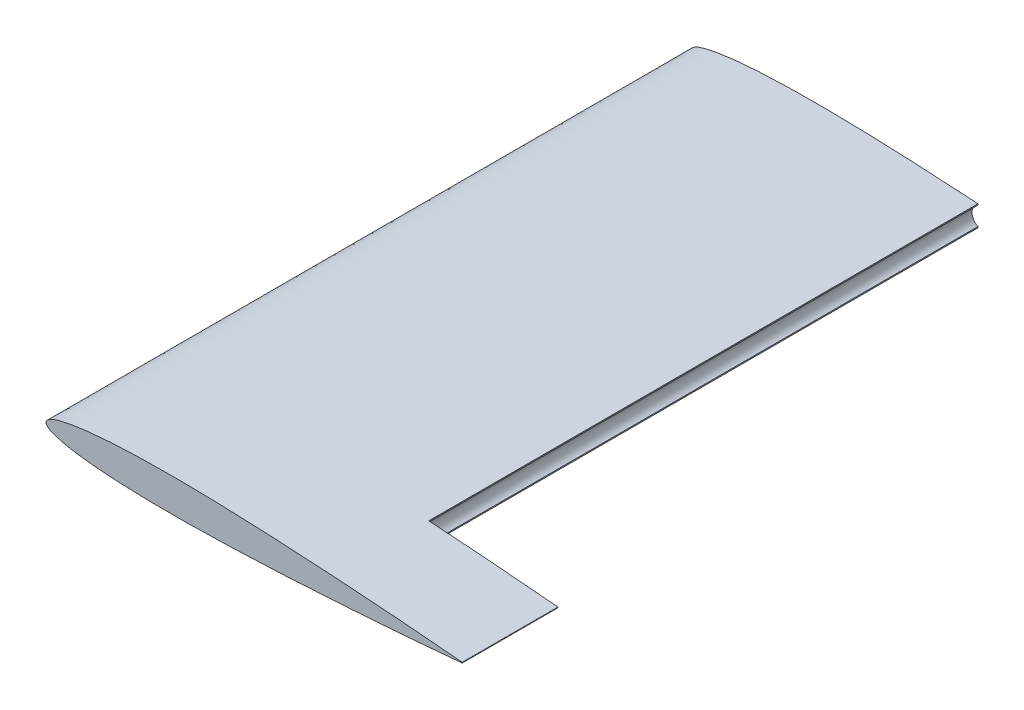
ISO-10303-21;
HEADER;
FILE_DESCRIPTION(('STEP AP214'),'2;1');
FILE_NAME('part.step','',(''),(''),'','','');
FILE_SCHEMA(('AUTOMOTIVE_DESIGN { 1 0 10303 214 1 1 1 1 }'));
ENDSEC;
DATA;
#1=APPLICATION_CONTEXT('core data for automotive mechanical design processes');
#2=APPLICATION_PROTOCOL_DEFINITION('international standard','automotive_design',2000,#1);
#3=PRODUCT_CONTEXT('',#1,'mechanical');
#4=PRODUCT('Part','Part','',(#3));
#5=PRODUCT_RELATED_PRODUCT_CATEGORY('part','',(#4));
#6=PRODUCT_DEFINITION_FORMATION('','',#4);
#7=PRODUCT_DEFINITION_CONTEXT('part definition',#1,'design');
#8=PRODUCT_DEFINITION('design','',#6,#7);
#9=PRODUCT_DEFINITION_SHAPE('','',#8);
#10=(LENGTH_UNIT() NAMED_UNIT(*) SI_UNIT(.MILLI.,.METRE.));
#11=(NAMED_UNIT(*) PLANE_ANGLE_UNIT() SI_UNIT($,.RADIAN.));
#12=(NAMED_UNIT(*) SI_UNIT($,.STERADIAN.) SOLID_ANGLE_UNIT());
#13=UNCERTAINTY_MEASURE_WITH_UNIT(LENGTH_MEASURE(1.E-05),#10,'distance_accuracy_value','');
#14=(GEOMETRIC_REPRESENTATION_CONTEXT(3) GLOBAL_UNCERTAINTY_ASSIGNED_CONTEXT((#13)) GLOBAL_UNIT_ASSIGNED_CONTEXT((#10,
#11,#12)) REPRESENTATION_CONTEXT('',''));
#15=CARTESIAN_POINT('',(0.,0.,0.));
#16=DIRECTION('',(0.,0.,1.));
#17=DIRECTION('',(1.,0.,0.));
#18=AXIS2_PLACEMENT_3D('',#15,#16,#17);
#19=CARTESIAN_POINT('',(34.75,0.,13.));
#20=DIRECTION('',(0.,0.,-1.));
#21=DIRECTION('',(-1.,0.,0.));
#22=AXIS2_PLACEMENT_3D('',#19,#20,#21);
#23=CYLINDRICAL_SURFACE('',#22,1.75);
#24=CARTESIAN_POINT('',(34.75,0.,0.));
#25=DIRECTION('',(0.,0.,-1.));
#26=DIRECTION('',(-1.,0.,0.));
#27=AXIS2_PLACEMENT_3D('',#24,#25,#26);
#28=CIRCLE('',#27,1.75);
#29=CARTESIAN_POINT('',(33.,0.,0.));
#30=VERTEX_POINT('',#29);
#31=EDGE_CURVE('E182',#30,#30,#28,.T.);
#32=CARTESIAN_POINT('',(34.75,0.,6.));
#33=DIRECTION('',(0.,0.,1.));
#34=DIRECTION('',(1.,0.,0.));
#35=AXIS2_PLACEMENT_3D('',#32,#33,#34);
#36=CIRCLE('',#35,1.75);
#37=CARTESIAN_POINT('',(33.,0.,6.));
#38=VERTEX_POINT('',#37);
#39=EDGE_CURVE('E139',#38,#38,#36,.F.);
#40=CARTESIAN_POINT('',(33.,0.,0.));
#41=CARTESIAN_POINT('',(33.,0.,0.0625000000000001));
#42=CARTESIAN_POINT('',(33.,0.,0.125));
#43=CARTESIAN_POINT('',(33.,0.,0.25));
#44=CARTESIAN_POINT('',(33.,0.,0.3125));
#45=CARTESIAN_POINT('',(33.,0.,0.4375));
#46=CARTESIAN_POINT('',(33.,0.,0.5));
#47=CARTESIAN_POINT('',(33.,0.,0.625000000000001));
#48=CARTESIAN_POINT('',(33.,0.,0.687500000000001));
#49=CARTESIAN_POINT('',(33.,0.,0.812500000000001));
#50=CARTESIAN_POINT('',(33.,0.,0.875000000000001));
#51=CARTESIAN_POINT('',(33.,0.,1.));
#52=CARTESIAN_POINT('',(33.,0.,1.0625));
#53=CARTESIAN_POINT('',(33.,0.,1.1875));
#54=CARTESIAN_POINT('',(33.,0.,1.25));
#55=CARTESIAN_POINT('',(33.,0.,1.375));
#56=CARTESIAN_POINT('',(33.,0.,1.4375));
#57=CARTESIAN_POINT('',(33.,0.,1.5625));
#58=CARTESIAN_POINT('',(33.,0.,1.625));
#59=CARTESIAN_POINT('',(33.,0.,1.75));
#60=CARTESIAN_POINT('',(33.,0.,1.8125));
#61=CARTESIAN_POINT('',(33.,0.,1.9375));
#62=CARTESIAN_POINT('',(33.,0.,2.));
#63=CARTESIAN_POINT('',(33.,0.,2.125));
#64=CARTESIAN_POINT('',(33.,0.,2.1875));
#65=CARTESIAN_POINT('',(33.,0.,2.3125));
#66=CARTESIAN_POINT('',(33.,0.,2.375));
#67=CARTESIAN_POINT('',(33.,0.,2.5));
#68=CARTESIAN_POINT('',(33.,0.,2.5625));
#69=CARTESIAN_POINT('',(33.,0.,2.6875));
#70=CARTESIAN_POINT('',(33.,0.,2.75));
#71=CARTESIAN_POINT('',(33.,0.,2.875));
#72=CARTESIAN_POINT('',(33.,0.,2.9375));
#73=CARTESIAN_POINT('',(33.,0.,3.0625));
#74=CARTESIAN_POINT('',(33.,0.,3.125));
#75=CARTESIAN_POINT('',(33.,0.,3.25));
#76=CARTESIAN_POINT('',(33.,0.,3.3125));
#77=CARTESIAN_POINT('',(33.,0.,3.4375));
#78=CARTESIAN_POINT('',(33.,0.,3.5));
#79=CARTESIAN_POINT('',(33.,0.,3.625));
#80=CARTESIAN_POINT('',(33.,0.,3.6875));
#81=CARTESIAN_POINT('',(33.,0.,3.8125));
#82=CARTESIAN_POINT('',(33.,0.,3.875));
#83=CARTESIAN_POINT('',(33.,0.,4.));
#84=CARTESIAN_POINT('',(33.,0.,4.0625));
#85=CARTESIAN_POINT('',(33.,0.,4.1875));
#86=CARTESIAN_POINT('',(33.,0.,4.25));
#87=CARTESIAN_POINT('',(33.,0.,4.375));
#88=CARTESIAN_POINT('',(33.,0.,4.4375));
#89=CARTESIAN_POINT('',(33.,0.,4.5625));
#90=CARTESIAN_POINT('',(33.,0.,4.625));
#91=CARTESIAN_POINT('',(33.,0.,4.75));
#92=CARTESIAN_POINT('',(33.,0.,4.8125));
#93=CARTESIAN_POINT('',(33.,0.,4.9375));
#94=CARTESIAN_POINT('',(33.,0.,5.));
#95=CARTESIAN_POINT('',(33.,0.,5.125));
#96=CARTESIAN_POINT('',(33.,0.,5.1875));
#97=CARTESIAN_POINT('',(33.,0.,5.3125));
#98=CARTESIAN_POINT('',(33.,0.,5.375));
#99=CARTESIAN_POINT('',(33.,0.,5.5));
#100=CARTESIAN_POINT('',(33.,0.,5.5625));
#101=CARTESIAN_POINT('',(33.,0.,5.6875));
#102=CARTESIAN_POINT('',(33.,0.,5.75));
#103=CARTESIAN_POINT('',(33.,0.,5.875));
#104=CARTESIAN_POINT('',(33.,0.,5.9375));
#105=CARTESIAN_POINT('',(33.,0.,6.));
#106=B_SPLINE_CURVE_WITH_KNOTS('',3,(#40,#41,#42,#43,#44,#45,#46,#47,#48,#49,#50,#51,#52,#53,
#54,#55,#56,#57,#58,#59,#60,#61,#62,#63,#64,#65,#66,#67,#68,#69,#70,#71,#72,#73,#74,#75,#76,#77,
#78,#79,#80,#81,#82,#83,#84,#85,#86,#87,#88,#89,#90,#91,#92,#93,#94,#95,#96,#97,#98,#99,#100,
#101,#102,#103,#104,#105),.UNSPECIFIED.,.F.,.F.,(4,2,2,2,2,2,2,2,2,2,2,2,2,2,2,2,2,2,2,2,2,2,2,
2,2,2,2,2,2,2,2,2,4),(0.,0.1875,0.375,0.5625,0.750000000000001,0.937500000000001,1.125,1.3125,
1.5,1.6875,1.875,2.0625,2.25,2.4375,2.625,2.8125,3.,3.1875,3.375,3.5625,3.75,3.9375,4.125,
4.3125,4.5,4.6875,4.875,5.0625,5.25,5.4375,5.625,5.8125,6.),.UNSPECIFIED.);
#107=EDGE_CURVE('BSEAM33',#30,#38,#106,.T.);
#108=ORIENTED_EDGE('',*,*,#31,.T.);
#109=ORIENTED_EDGE('',*,*,#39,.F.);
#110=ORIENTED_EDGE('',*,*,#107,.T.);
#111=ORIENTED_EDGE('',*,*,#107,.F.);
#112=EDGE_LOOP('',(#108,#110,#109,#111));
#113=FACE_BOUND('',#112,.T.);
#114=ADVANCED_FACE('F33',(#113),#23,.F.);
#115=CARTESIAN_POINT('',(71.,0.,0.));
#116=DIRECTION('',(0.,0.,1.));
#117=DIRECTION('',(1.,0.,0.));
#118=AXIS2_PLACEMENT_3D('',#115,#116,#117);
#119=CYLINDRICAL_SURFACE('',#118,1.5);
#120=CARTESIAN_POINT('',(71.,0.,132.));
#121=DIRECTION('',(0.,0.,-1.));
#122=DIRECTION('',(-1.,0.,0.));
#123=AXIS2_PLACEMENT_3D('',#120,#121,#122);
#124=CIRCLE('',#123,1.5);
#125=CARTESIAN_POINT('',(69.5,0.,132.));
#126=VERTEX_POINT('',#125);
#127=EDGE_CURVE('E189',#126,#126,#124,.T.);
#128=ORIENTED_EDGE('',*,*,#127,.T.);
#129=EDGE_LOOP('',(#128));
#130=FACE_BOUND('',#129,.T.);
#131=CARTESIAN_POINT('',(71.,0.,150.));
#132=DIRECTION('',(0.,0.,1.));
#133=DIRECTION('',(1.,0.,0.));
#134=AXIS2_PLACEMENT_3D('',#131,#132,#133);
#135=CIRCLE('',#134,1.5);
#136=CARTESIAN_POINT('',(72.5,0.,150.));
#137=VERTEX_POINT('',#136);
#138=EDGE_CURVE('E261',#137,#137,#135,.F.);
#139=ORIENTED_EDGE('',*,*,#138,.F.);
#140=EDGE_LOOP('',(#139));
#141=FACE_BOUND('',#140,.T.);
#142=ADVANCED_FACE('F295',(#130,#141),#119,.F.);
#143=CARTESIAN_POINT('',(25.,0.,0.));
#144=DIRECTION('',(0.,0.,1.));
#145=DIRECTION('',(1.,0.,0.));
#146=AXIS2_PLACEMENT_3D('',#143,#144,#145);
#147=CYLINDRICAL_SURFACE('',#146,3.);
#148=CARTESIAN_POINT('',(25.,0.,0.));
#149=DIRECTION('',(0.,0.,1.));
#150=DIRECTION('',(1.,0.,0.));
#151=AXIS2_PLACEMENT_3D('',#148,#149,#150);
#152=CIRCLE('',#151,3.);
#153=CARTESIAN_POINT('',(28.,0.,0.));
#154=VERTEX_POINT('',#153);
#155=EDGE_CURVE('E209',#154,#154,#152,.T.);
#156=ORIENTED_EDGE('',*,*,#155,.F.);
#157=EDGE_LOOP('',(#156));
#158=FACE_BOUND('',#157,.T.);
#159=CARTESIAN_POINT('',(25.,0.,150.));
#160=DIRECTION('',(0.,0.,1.));
#161=DIRECTION('',(1.,0.,0.));
#162=AXIS2_PLACEMENT_3D('',#159,#160,#161);
#163=CIRCLE('',#162,3.);
#164=CARTESIAN_POINT('',(28.,0.,150.));
#165=VERTEX_POINT('',#164);
#166=EDGE_CURVE('E248',#165,#165,#163,.F.);
#167=ORIENTED_EDGE('',*,*,#166,.F.);
#168=EDGE_LOOP('',(#167));
#169=FACE_BOUND('',#168,.T.);
#170=ADVANCED_FACE('F303',(#158,#169),#147,.F.);
#171=CARTESIAN_POINT('',(100.,0.084,132.));
#172=CARTESIAN_POINT('',(98.333488814933,0.236746480055364,132.));
#173=CARTESIAN_POINT('',(95.0011947254255,0.542172688557606,132.));
#174=CARTESIAN_POINT('',(88.3355596211879,1.11089898015662,132.));
#175=CARTESIAN_POINT('',(80.0032933562199,1.76361099520967,132.));
#176=CARTESIAN_POINT('',(70.0029989334555,2.45786169254404,132.));
#177=CARTESIAN_POINT('',(60.0031046254057,3.06174772348002,132.));
#178=CARTESIAN_POINT('',(50.0030086005351,3.55213921170033,132.));
#179=CARTESIAN_POINT('',(40.0025985576922,3.90294649372571,132.));
#180=CARTESIAN_POINT('',(31.666961485844,4.02526015065941,132.));
#181=CARTESIAN_POINT('',(24.9991546003269,3.97693379087482,132.));
#182=CARTESIAN_POINT('',(19.9977755867835,3.84497639830756,132.));
#183=CARTESIAN_POINT('',(14.9933631314586,3.59248695861782,132.));
#184=CARTESIAN_POINT('',(10.8271840648808,3.23765157891607,132.));
#185=CARTESIAN_POINT('',(7.48905438800269,2.81402136675529,132.));
#186=CARTESIAN_POINT('',(4.99359465012965,2.40367305928858,132.));
#187=CARTESIAN_POINT('',(2.84962633983361,1.86792549429032,132.));
#188=CARTESIAN_POINT('',(1.16541350274339,1.32098725183071,132.));
#189=CARTESIAN_POINT('',(-0.664613784127027,0.,132.));
#190=CARTESIAN_POINT('',(1.16541350274339,-1.32098725183071,132.));
#191=CARTESIAN_POINT('',(2.84962633983362,-1.86792549429032,132.));
#192=CARTESIAN_POINT('',(4.99359465012963,-2.40367305928857,132.));
#193=CARTESIAN_POINT('',(7.48905438800269,-2.81402136675529,132.));
#194=CARTESIAN_POINT('',(10.8271840648809,-3.23765157891607,132.));
#195=CARTESIAN_POINT('',(14.9933631314586,-3.59248695861782,132.));
#196=CARTESIAN_POINT('',(19.9977755867835,-3.84497639830756,132.));
#197=CARTESIAN_POINT('',(24.9991546003269,-3.97693379087482,132.));
#198=CARTESIAN_POINT('',(31.666961485844,-4.02526015065941,132.));
#199=CARTESIAN_POINT('',(40.0025985576922,-3.90294649372571,132.));
#200=CARTESIAN_POINT('',(50.0030086005351,-3.55213921170033,132.));
#201=CARTESIAN_POINT('',(60.0031046254058,-3.06174772348002,132.));
#202=CARTESIAN_POINT('',(70.0029989334555,-2.45786169254404,132.));
#203=CARTESIAN_POINT('',(80.0032933562199,-1.76361099520967,132.));
#204=CARTESIAN_POINT('',(88.3355596211879,-1.11089898015662,132.));
#205=CARTESIAN_POINT('',(95.0011947254255,-0.542172688557605,132.));
#206=CARTESIAN_POINT('',(98.333488814933,-0.236746480055364,132.));
#207=CARTESIAN_POINT('',(100.,-0.084,132.));
#208=B_SPLINE_CURVE_WITH_KNOTS('',3,(#171,#172,#173,#174,#175,#176,#177,#178,#179,#180,#181,
#182,#183,#184,#185,#186,#187,#188,#189,#190,#191,#192,#193,#194,#195,#196,#197,#198,#199,#200,
#201,#202,#203,#204,#205,#206,#207),.UNSPECIFIED.,.F.,.F.,(4,1,1,1,1,1,1,1,1,1,1,1,1,1,1,1,1,1,
1,1,1,1,1,1,1,1,1,1,1,1,1,1,1,1,4),(0.,0.0248762929189861,0.0497417146704998,0.0994434021110951,
0.149112224036195,0.198750974066913,0.248359097492202,0.297937369716024,0.347491327096237,
0.37226694027957,0.39705092368842,0.421859474838904,0.446731345826762,0.459220451479859,
0.471790601601357,0.484560454432956,0.491195112481227,0.5,0.508804887518773,0.515439545567044,
0.528209398398643,0.540779548520141,0.553268654173238,0.578140525161096,0.60294907631158,
0.62773305972043,0.652508672903763,0.702062630283976,0.751640902507798,0.801249025933086,
0.850887775963805,0.900556597888905,0.9502582853295,0.975123707081014,1.),.UNSPECIFIED.);
#209=DIRECTION('',(0.,0.,-1.));
#210=VECTOR('',#209,1.);
#211=SURFACE_OF_LINEAR_EXTRUSION('',#208,#210);
#212=DIRECTION('',(0.,0.,-1.));
#213=VECTOR('',#212,1.);
#214=CARTESIAN_POINT('',(31.25,-3.998671777626,132.));
#215=LINE('',#214,#213);
#216=CARTESIAN_POINT('',(31.25,-3.998671777626,9.));
#217=VERTEX_POINT('',#216);
#218=CARTESIAN_POINT('',(31.2499999999995,-3.998671777626,6.00000000000001));
#219=VERTEX_POINT('',#218);
#220=EDGE_CURVE('E42',#217,#219,#215,.T.);
#221=ORIENTED_EDGE('',*,*,#220,.F.);
#222=CARTESIAN_POINT('',(100.,0.084,9.00000000000001));
#223=CARTESIAN_POINT('',(98.333488814933,0.236746480055364,9.00000000000001));
#224=CARTESIAN_POINT('',(95.0011947254255,0.542172688557606,9.00000000000001));
#225=CARTESIAN_POINT('',(88.3355596211879,1.11089898015662,9.00000000000001));
#226=CARTESIAN_POINT('',(80.0032933562199,1.76361099520967,9.00000000000001));
#227=CARTESIAN_POINT('',(70.0029989334555,2.45786169254404,9.00000000000001));
#228=CARTESIAN_POINT('',(60.0031046254057,3.06174772348002,9.00000000000001));
#229=CARTESIAN_POINT('',(50.0030086005351,3.55213921170033,9.00000000000001));
#230=CARTESIAN_POINT('',(40.0025985576922,3.90294649372571,9.00000000000001));
#231=CARTESIAN_POINT('',(31.666961485844,4.02526015065941,9.00000000000001));
#232=CARTESIAN_POINT('',(24.9991546003269,3.97693379087482,9.00000000000001));
#233=CARTESIAN_POINT('',(19.9977755867835,3.84497639830756,9.00000000000001));
#234=CARTESIAN_POINT('',(14.9933631314586,3.59248695861782,9.00000000000001));
#235=CARTESIAN_POINT('',(10.8271840648808,3.23765157891607,9.00000000000001));
#236=CARTESIAN_POINT('',(7.48905438800269,2.81402136675529,9.00000000000001));
#237=CARTESIAN_POINT('',(4.99359465012965,2.40367305928858,9.00000000000001));
#238=CARTESIAN_POINT('',(2.84962633983361,1.86792549429032,9.00000000000001));
#239=CARTESIAN_POINT('',(1.16541350274339,1.32098725183071,9.00000000000001));
#240=CARTESIAN_POINT('',(-0.664613784127027,0.,9.00000000000001));
#241=CARTESIAN_POINT('',(1.16541350274339,-1.32098725183071,9.00000000000001));
#242=CARTESIAN_POINT('',(2.84962633983362,-1.86792549429032,9.00000000000001));
#243=CARTESIAN_POINT('',(4.99359465012963,-2.40367305928857,9.00000000000001));
#244=CARTESIAN_POINT('',(7.48905438800269,-2.81402136675529,9.00000000000001));
#245=CARTESIAN_POINT('',(10.8271840648809,-3.23765157891607,9.00000000000001));
#246=CARTESIAN_POINT('',(14.9933631314586,-3.59248695861782,9.00000000000001));
#247=CARTESIAN_POINT('',(19.9977755867835,-3.84497639830756,9.00000000000001));
#248=CARTESIAN_POINT('',(24.9991546003269,-3.97693379087482,9.00000000000001));
#249=CARTESIAN_POINT('',(31.666961485844,-4.02526015065941,9.00000000000001));
#250=CARTESIAN_POINT('',(40.0025985576922,-3.90294649372571,9.00000000000001));
#251=CARTESIAN_POINT('',(50.0030086005351,-3.55213921170033,9.00000000000001));
#252=CARTESIAN_POINT('',(60.0031046254058,-3.06174772348002,9.00000000000001));
#253=CARTESIAN_POINT('',(70.0029989334555,-2.45786169254404,9.00000000000001));
#254=CARTESIAN_POINT('',(80.0032933562199,-1.76361099520967,9.00000000000001));
#255=CARTESIAN_POINT('',(88.3355596211879,-1.11089898015662,9.00000000000001));
#256=CARTESIAN_POINT('',(95.0011947254255,-0.542172688557605,9.00000000000001));
#257=CARTESIAN_POINT('',(98.333488814933,-0.236746480055364,9.00000000000001));
#258=CARTESIAN_POINT('',(100.,-0.084,9.00000000000001));
#259=B_SPLINE_CURVE_WITH_KNOTS('',3,(#222,#223,#224,#225,#226,#227,#228,#229,#230,#231,#232,
#233,#234,#235,#236,#237,#238,#239,#240,#241,#242,#243,#244,#245,#246,#247,#248,#249,#250,#251,
#252,#253,#254,#255,#256,#257,#258),.UNSPECIFIED.,.F.,.F.,(4,1,1,1,1,1,1,1,1,1,1,1,1,1,1,1,1,1,
1,1,1,1,1,1,1,1,1,1,1,1,1,1,1,1,4),(0.,0.0248762929189861,0.0497417146704998,0.0994434021110951,
0.149112224036195,0.198750974066913,0.248359097492202,0.297937369716024,0.347491327096237,
0.37226694027957,0.39705092368842,0.421859474838904,0.446731345826762,0.459220451479859,
0.471790601601357,0.484560454432956,0.491195112481227,0.5,0.508804887518773,0.515439545567044,
0.528209398398643,0.540779548520141,0.553268654173238,0.578140525161096,0.60294907631158,
0.62773305972043,0.652508672903763,0.702062630283976,0.751640902507798,0.801249025933086,
0.850887775963805,0.900556597888905,0.9502582853295,0.975123707081014,1.),.UNSPECIFIED.);
#260=CARTESIAN_POINT('',(38.25,-3.90932108761624,9.));
#261=VERTEX_POINT('',#260);
#262=EDGE_CURVE('E175',#217,#261,#259,.T.);
#263=ORIENTED_EDGE('',*,*,#262,.T.);
#264=DIRECTION('',(0.,0.,-1.));
#265=VECTOR('',#264,1.);
#266=CARTESIAN_POINT('',(38.25,-3.90932108761621,132.));
#267=LINE('',#266,#265);
#268=CARTESIAN_POINT('',(38.25,-3.90932108761624,6.));
#269=VERTEX_POINT('',#268);
#270=EDGE_CURVE('E11',#269,#261,#267,.F.);
#271=ORIENTED_EDGE('',*,*,#270,.F.);
#272=CARTESIAN_POINT('',(100.,0.084,6.00000000000001));
#273=CARTESIAN_POINT('',(98.333488814933,0.236746480055364,6.00000000000001));
#274=CARTESIAN_POINT('',(95.0011947254255,0.542172688557606,6.00000000000001));
#275=CARTESIAN_POINT('',(88.3355596211879,1.11089898015662,6.00000000000001));
#276=CARTESIAN_POINT('',(80.0032933562199,1.76361099520967,6.00000000000001));
#277=CARTESIAN_POINT('',(70.0029989334555,2.45786169254404,6.00000000000001));
#278=CARTESIAN_POINT('',(60.0031046254057,3.06174772348002,6.00000000000001));
#279=CARTESIAN_POINT('',(50.0030086005351,3.55213921170033,6.00000000000001));
#280=CARTESIAN_POINT('',(40.0025985576922,3.90294649372571,6.00000000000001));
#281=CARTESIAN_POINT('',(31.666961485844,4.02526015065941,6.00000000000001));
#282=CARTESIAN_POINT('',(24.9991546003269,3.97693379087482,6.00000000000001));
#283=CARTESIAN_POINT('',(19.9977755867835,3.84497639830756,6.00000000000001));
#284=CARTESIAN_POINT('',(14.9933631314586,3.59248695861782,6.00000000000001));
#285=CARTESIAN_POINT('',(10.8271840648808,3.23765157891607,6.00000000000001));
#286=CARTESIAN_POINT('',(7.48905438800269,2.81402136675529,6.00000000000001));
#287=CARTESIAN_POINT('',(4.99359465012965,2.40367305928858,6.00000000000001));
#288=CARTESIAN_POINT('',(2.84962633983361,1.86792549429032,6.00000000000001));
#289=CARTESIAN_POINT('',(1.16541350274339,1.32098725183071,6.00000000000001));
#290=CARTESIAN_POINT('',(-0.664613784127027,0.,6.00000000000001));
#291=CARTESIAN_POINT('',(1.16541350274339,-1.32098725183071,6.00000000000001));
#292=CARTESIAN_POINT('',(2.84962633983362,-1.86792549429032,6.00000000000001));
#293=CARTESIAN_POINT('',(4.99359465012963,-2.40367305928857,6.00000000000001));
#294=CARTESIAN_POINT('',(7.48905438800269,-2.81402136675529,6.00000000000001));
#295=CARTESIAN_POINT('',(10.8271840648809,-3.23765157891607,6.00000000000001));
#296=CARTESIAN_POINT('',(14.9933631314586,-3.59248695861782,6.00000000000001));
#297=CARTESIAN_POINT('',(19.9977755867835,-3.84497639830756,6.00000000000001));
#298=CARTESIAN_POINT('',(24.9991546003269,-3.97693379087482,6.00000000000001));
#299=CARTESIAN_POINT('',(31.666961485844,-4.02526015065941,6.00000000000001));
#300=CARTESIAN_POINT('',(40.0025985576922,-3.90294649372571,6.00000000000001));
#301=CARTESIAN_POINT('',(50.0030086005351,-3.55213921170033,6.00000000000001));
#302=CARTESIAN_POINT('',(60.0031046254058,-3.06174772348002,6.00000000000001));
#303=CARTESIAN_POINT('',(70.0029989334555,-2.45786169254404,6.00000000000001));
#304=CARTESIAN_POINT('',(80.0032933562199,-1.76361099520967,6.00000000000001));
#305=CARTESIAN_POINT('',(88.3355596211879,-1.11089898015662,6.00000000000001));
#306=CARTESIAN_POINT('',(95.0011947254255,-0.542172688557605,6.00000000000001));
#307=CARTESIAN_POINT('',(98.333488814933,-0.236746480055364,6.00000000000001));
#308=CARTESIAN_POINT('',(100.,-0.084,6.00000000000001));
#309=B_SPLINE_CURVE_WITH_KNOTS('',3,(#272,#273,#274,#275,#276,#277,#278,#279,#280,#281,#282,
#283,#284,#285,#286,#287,#288,#289,#290,#291,#292,#293,#294,#295,#296,#297,#298,#299,#300,#301,
#302,#303,#304,#305,#306,#307,#308),.UNSPECIFIED.,.F.,.F.,(4,1,1,1,1,1,1,1,1,1,1,1,1,1,1,1,1,1,
1,1,1,1,1,1,1,1,1,1,1,1,1,1,1,1,4),(0.,0.0248762929189861,0.0497417146704998,0.0994434021110951,
0.149112224036195,0.198750974066913,0.248359097492202,0.297937369716024,0.347491327096237,
0.37226694027957,0.39705092368842,0.421859474838904,0.446731345826762,0.459220451479859,
0.471790601601357,0.484560454432956,0.491195112481227,0.5,0.508804887518773,0.515439545567044,
0.528209398398643,0.540779548520141,0.553268654173238,0.578140525161096,0.60294907631158,
0.62773305972043,0.652508672903763,0.702062630283976,0.751640902507798,0.801249025933086,
0.850887775963805,0.900556597888905,0.9502582853295,0.975123707081014,1.),.UNSPECIFIED.);
#310=EDGE_CURVE('E170',#219,#269,#309,.T.);
#311=ORIENTED_EDGE('',*,*,#310,.F.);
#312=EDGE_LOOP('',(#221,#263,#271,#311));
#313=FACE_BOUND('',#312,.T.);
#314=CARTESIAN_POINT('',(100.,0.084,0.));
#315=CARTESIAN_POINT('',(98.333488814933,0.236746480055364,0.));
#316=CARTESIAN_POINT('',(95.0011947254255,0.542172688557606,0.));
#317=CARTESIAN_POINT('',(88.3355596211879,1.11089898015662,0.));
#318=CARTESIAN_POINT('',(80.0032933562199,1.76361099520967,0.));
#319=CARTESIAN_POINT('',(70.0029989334555,2.45786169254404,0.));
#320=CARTESIAN_POINT('',(60.0031046254057,3.06174772348002,0.));
#321=CARTESIAN_POINT('',(50.0030086005351,3.55213921170033,0.));
#322=CARTESIAN_POINT('',(40.0025985576922,3.90294649372571,0.));
#323=CARTESIAN_POINT('',(31.666961485844,4.02526015065941,0.));
#324=CARTESIAN_POINT('',(24.9991546003269,3.97693379087482,0.));
#325=CARTESIAN_POINT('',(19.9977755867835,3.84497639830756,0.));
#326=CARTESIAN_POINT('',(14.9933631314586,3.59248695861782,0.));
#327=CARTESIAN_POINT('',(10.8271840648808,3.23765157891607,0.));
#328=CARTESIAN_POINT('',(7.48905438800269,2.81402136675529,0.));
#329=CARTESIAN_POINT('',(4.99359465012965,2.40367305928858,0.));
#330=CARTESIAN_POINT('',(2.84962633983361,1.86792549429032,0.));
#331=CARTESIAN_POINT('',(1.16541350274339,1.32098725183071,0.));
#332=CARTESIAN_POINT('',(-0.664613784127027,0.,0.));
#333=CARTESIAN_POINT('',(1.16541350274339,-1.32098725183071,0.));
#334=CARTESIAN_POINT('',(2.84962633983362,-1.86792549429032,0.));
#335=CARTESIAN_POINT('',(4.99359465012963,-2.40367305928857,0.));
#336=CARTESIAN_POINT('',(7.48905438800269,-2.81402136675529,0.));
#337=CARTESIAN_POINT('',(10.8271840648809,-3.23765157891607,0.));
#338=CARTESIAN_POINT('',(14.9933631314586,-3.59248695861782,0.));
#339=CARTESIAN_POINT('',(19.9977755867835,-3.84497639830756,0.));
#340=CARTESIAN_POINT('',(24.9991546003269,-3.97693379087482,0.));
#341=CARTESIAN_POINT('',(31.666961485844,-4.02526015065941,0.));
#342=CARTESIAN_POINT('',(40.0025985576922,-3.90294649372571,0.));
#343=CARTESIAN_POINT('',(50.0030086005351,-3.55213921170033,0.));
#344=CARTESIAN_POINT('',(60.0031046254058,-3.06174772348002,0.));
#345=CARTESIAN_POINT('',(70.0029989334555,-2.45786169254404,0.));
#346=CARTESIAN_POINT('',(80.0032933562199,-1.76361099520967,0.));
#347=CARTESIAN_POINT('',(88.3355596211879,-1.11089898015662,0.));
#348=CARTESIAN_POINT('',(95.0011947254255,-0.542172688557605,0.));
#349=CARTESIAN_POINT('',(98.333488814933,-0.236746480055364,0.));
#350=CARTESIAN_POINT('',(100.,-0.084,0.));
#351=B_SPLINE_CURVE_WITH_KNOTS('',3,(#314,#315,#316,#317,#318,#319,#320,#321,#322,#323,#324,
#325,#326,#327,#328,#329,#330,#331,#332,#333,#334,#335,#336,#337,#338,#339,#340,#341,#342,#343,
#344,#345,#346,#347,#348,#349,#350),.UNSPECIFIED.,.F.,.F.,(4,1,1,1,1,1,1,1,1,1,1,1,1,1,1,1,1,1,
1,1,1,1,1,1,1,1,1,1,1,1,1,1,1,1,4),(0.,0.0248762929189861,0.0497417146704998,0.0994434021110951,
0.149112224036195,0.198750974066913,0.248359097492202,0.297937369716024,0.347491327096237,
0.37226694027957,0.39705092368842,0.421859474838904,0.446731345826762,0.459220451479859,
0.471790601601357,0.484560454432956,0.491195112481227,0.5,0.508804887518773,0.515439545567044,
0.528209398398643,0.540779548520141,0.553268654173238,0.578140525161096,0.60294907631158,
0.62773305972043,0.652508672903763,0.702062630283976,0.751640902507798,0.801249025933086,
0.850887775963805,0.900556597888905,0.9502582853295,0.975123707081014,1.),.UNSPECIFIED.);
#352=CARTESIAN_POINT('',(68.9999999999599,2.50744788018033,0.));
#353=VERTEX_POINT('',#352);
#354=CARTESIAN_POINT('',(68.9999999766901,-2.50744788166933,0.));
#355=VERTEX_POINT('',#354);
#356=EDGE_CURVE('E237',#353,#355,#351,.T.);
#357=ORIENTED_EDGE('',*,*,#356,.T.);
#358=DIRECTION('',(0.,0.,-1.));
#359=VECTOR('',#358,1.);
#360=CARTESIAN_POINT('',(68.9999999999599,-2.50744788017844,137.843729929357));
#361=LINE('',#360,#359);
#362=CARTESIAN_POINT('',(68.9999999999599,-2.50744788017844,132.));
#363=VERTEX_POINT('',#362);
#364=EDGE_CURVE('E201',#363,#355,#361,.T.);
#365=ORIENTED_EDGE('',*,*,#364,.F.);
#366=CARTESIAN_POINT('',(100.,0.084,132.));
#367=CARTESIAN_POINT('',(98.333488814933,0.236746480055364,132.));
#368=CARTESIAN_POINT('',(95.0011947254255,0.542172688557606,132.));
#369=CARTESIAN_POINT('',(88.3355596211879,1.11089898015662,132.));
#370=CARTESIAN_POINT('',(80.0032933562199,1.76361099520967,132.));
#371=CARTESIAN_POINT('',(70.0029989334555,2.45786169254404,132.));
#372=CARTESIAN_POINT('',(60.0031046254057,3.06174772348002,132.));
#373=CARTESIAN_POINT('',(50.0030086005351,3.55213921170033,132.));
#374=CARTESIAN_POINT('',(40.0025985576922,3.90294649372571,132.));
#375=CARTESIAN_POINT('',(31.666961485844,4.02526015065941,132.));
#376=CARTESIAN_POINT('',(24.9991546003269,3.97693379087482,132.));
#377=CARTESIAN_POINT('',(19.9977755867835,3.84497639830756,132.));
#378=CARTESIAN_POINT('',(14.9933631314586,3.59248695861782,132.));
#379=CARTESIAN_POINT('',(10.8271840648808,3.23765157891607,132.));
#380=CARTESIAN_POINT('',(7.48905438800269,2.81402136675529,132.));
#381=CARTESIAN_POINT('',(4.99359465012965,2.40367305928858,132.));
#382=CARTESIAN_POINT('',(2.84962633983361,1.86792549429032,132.));
#383=CARTESIAN_POINT('',(1.16541350274339,1.32098725183071,132.));
#384=CARTESIAN_POINT('',(-0.664613784127027,0.,132.));
#385=CARTESIAN_POINT('',(1.16541350274339,-1.32098725183071,132.));
#386=CARTESIAN_POINT('',(2.84962633983362,-1.86792549429032,132.));
#387=CARTESIAN_POINT('',(4.99359465012963,-2.40367305928857,132.));
#388=CARTESIAN_POINT('',(7.48905438800269,-2.81402136675529,132.));
#389=CARTESIAN_POINT('',(10.8271840648809,-3.23765157891607,132.));
#390=CARTESIAN_POINT('',(14.9933631314586,-3.59248695861782,132.));
#391=CARTESIAN_POINT('',(19.9977755867835,-3.84497639830756,132.));
#392=CARTESIAN_POINT('',(24.9991546003269,-3.97693379087482,132.));
#393=CARTESIAN_POINT('',(31.666961485844,-4.02526015065941,132.));
#394=CARTESIAN_POINT('',(40.0025985576922,-3.90294649372571,132.));
#395=CARTESIAN_POINT('',(50.0030086005351,-3.55213921170033,132.));
#396=CARTESIAN_POINT('',(60.0031046254058,-3.06174772348002,132.));
#397=CARTESIAN_POINT('',(70.0029989334555,-2.45786169254404,132.));
#398=CARTESIAN_POINT('',(80.0032933562199,-1.76361099520967,132.));
#399=CARTESIAN_POINT('',(88.3355596211879,-1.11089898015662,132.));
#400=CARTESIAN_POINT('',(95.0011947254255,-0.542172688557605,132.));
#401=CARTESIAN_POINT('',(98.333488814933,-0.236746480055364,132.));
#402=CARTESIAN_POINT('',(100.,-0.084,132.));
#403=B_SPLINE_CURVE_WITH_KNOTS('',3,(#366,#367,#368,#369,#370,#371,#372,#373,#374,#375,#376,
#377,#378,#379,#380,#381,#382,#383,#384,#385,#386,#387,#388,#389,#390,#391,#392,#393,#394,#395,
#396,#397,#398,#399,#400,#401,#402),.UNSPECIFIED.,.F.,.F.,(4,1,1,1,1,1,1,1,1,1,1,1,1,1,1,1,1,1,
1,1,1,1,1,1,1,1,1,1,1,1,1,1,1,1,4),(0.,0.0248762929189861,0.0497417146704998,0.0994434021110951,
0.149112224036195,0.198750974066913,0.248359097492202,0.297937369716024,0.347491327096237,
0.37226694027957,0.39705092368842,0.421859474838904,0.446731345826762,0.459220451479859,
0.471790601601357,0.484560454432956,0.491195112481227,0.5,0.508804887518773,0.515439545567044,
0.528209398398643,0.540779548520141,0.553268654173238,0.578140525161096,0.60294907631158,
0.62773305972043,0.652508672903763,0.702062630283976,0.751640902507798,0.801249025933086,
0.850887775963805,0.900556597888905,0.9502582853295,0.975123707081014,1.),.UNSPECIFIED.);
#404=CARTESIAN_POINT('',(100.,-0.084,132.));
#405=VERTEX_POINT('',#404);
#406=EDGE_CURVE('E212',#363,#405,#403,.T.);
#407=ORIENTED_EDGE('',*,*,#406,.T.);
#408=DIRECTION('',(0.,0.,-1.));
#409=VECTOR('',#408,1.);
#410=CARTESIAN_POINT('',(100.,-0.084,155.));
#411=LINE('',#410,#409);
#412=CARTESIAN_POINT('',(100.,-0.084,155.));
#413=VERTEX_POINT('',#412);
#414=EDGE_CURVE('E235',#413,#405,#411,.T.);
#415=ORIENTED_EDGE('',*,*,#414,.F.);
#416=CARTESIAN_POINT('',(100.,0.084,155.));
#417=CARTESIAN_POINT('',(98.333488814933,0.236746480055364,155.));
#418=CARTESIAN_POINT('',(95.0011947254255,0.542172688557606,155.));
#419=CARTESIAN_POINT('',(88.3355596211879,1.11089898015662,155.));
#420=CARTESIAN_POINT('',(80.0032933562199,1.76361099520967,155.));
#421=CARTESIAN_POINT('',(70.0029989334555,2.45786169254404,155.));
#422=CARTESIAN_POINT('',(60.0031046254057,3.06174772348002,155.));
#423=CARTESIAN_POINT('',(50.0030086005351,3.55213921170033,155.));
#424=CARTESIAN_POINT('',(40.0025985576922,3.90294649372571,155.));
#425=CARTESIAN_POINT('',(31.666961485844,4.02526015065941,155.));
#426=CARTESIAN_POINT('',(24.9991546003269,3.97693379087482,155.));
#427=CARTESIAN_POINT('',(19.9977755867835,3.84497639830756,155.));
#428=CARTESIAN_POINT('',(14.9933631314586,3.59248695861782,155.));
#429=CARTESIAN_POINT('',(10.8271840648808,3.23765157891607,155.));
#430=CARTESIAN_POINT('',(7.48905438800269,2.81402136675529,155.));
#431=CARTESIAN_POINT('',(4.99359465012965,2.40367305928858,155.));
#432=CARTESIAN_POINT('',(2.84962633983361,1.86792549429032,155.));
#433=CARTESIAN_POINT('',(1.16541350274339,1.32098725183071,155.));
#434=CARTESIAN_POINT('',(-0.664613784127027,0.,155.));
#435=CARTESIAN_POINT('',(1.16541350274339,-1.32098725183071,155.));
#436=CARTESIAN_POINT('',(2.84962633983362,-1.86792549429032,155.));
#437=CARTESIAN_POINT('',(4.99359465012963,-2.40367305928857,155.));
#438=CARTESIAN_POINT('',(7.48905438800269,-2.81402136675529,155.));
#439=CARTESIAN_POINT('',(10.8271840648809,-3.23765157891607,155.));
#440=CARTESIAN_POINT('',(14.9933631314586,-3.59248695861782,155.));
#441=CARTESIAN_POINT('',(19.9977755867835,-3.84497639830756,155.));
#442=CARTESIAN_POINT('',(24.9991546003269,-3.97693379087482,155.));
#443=CARTESIAN_POINT('',(31.666961485844,-4.02526015065941,155.));
#444=CARTESIAN_POINT('',(40.0025985576922,-3.90294649372571,155.));
#445=CARTESIAN_POINT('',(50.0030086005351,-3.55213921170033,155.));
#446=CARTESIAN_POINT('',(60.0031046254058,-3.06174772348002,155.));
#447=CARTESIAN_POINT('',(70.0029989334555,-2.45786169254404,155.));
#448=CARTESIAN_POINT('',(80.0032933562199,-1.76361099520967,155.));
#449=CARTESIAN_POINT('',(88.3355596211879,-1.11089898015662,155.));
#450=CARTESIAN_POINT('',(95.0011947254255,-0.542172688557605,155.));
#451=CARTESIAN_POINT('',(98.333488814933,-0.236746480055364,155.));
#452=CARTESIAN_POINT('',(100.,-0.084,155.));
#453=B_SPLINE_CURVE_WITH_KNOTS('',3,(#416,#417,#418,#419,#420,#421,#422,#423,#424,#425,#426,
#427,#428,#429,#430,#431,#432,#433,#434,#435,#436,#437,#438,#439,#440,#441,#442,#443,#444,#445,
#446,#447,#448,#449,#450,#451,#452),.UNSPECIFIED.,.F.,.F.,(4,1,1,1,1,1,1,1,1,1,1,1,1,1,1,1,1,1,
1,1,1,1,1,1,1,1,1,1,1,1,1,1,1,1,4),(0.,0.0248762929189861,0.0497417146704998,0.0994434021110951,
0.149112224036195,0.198750974066913,0.248359097492202,0.297937369716024,0.347491327096237,
0.37226694027957,0.39705092368842,0.421859474838904,0.446731345826762,0.459220451479859,
0.471790601601357,0.484560454432956,0.491195112481227,0.5,0.508804887518773,0.515439545567044,
0.528209398398643,0.540779548520141,0.553268654173238,0.578140525161096,0.60294907631158,
0.62773305972043,0.652508672903763,0.702062630283976,0.751640902507798,0.801249025933086,
0.850887775963805,0.900556597888905,0.9502582853295,0.975123707081014,1.),.UNSPECIFIED.);
#454=CARTESIAN_POINT('',(100.,0.084,155.));
#455=VERTEX_POINT('',#454);
#456=EDGE_CURVE('E213',#455,#413,#453,.T.);
#457=ORIENTED_EDGE('',*,*,#456,.F.);
#458=DIRECTION('',(0.,0.,-1.));
#459=VECTOR('',#458,1.);
#460=CARTESIAN_POINT('',(100.,0.084,155.));
#461=LINE('',#460,#459);
#462=CARTESIAN_POINT('',(100.,0.084,132.));
#463=VERTEX_POINT('',#462);
#464=EDGE_CURVE('E224',#455,#463,#461,.T.);
#465=ORIENTED_EDGE('',*,*,#464,.T.);
#466=CARTESIAN_POINT('',(68.9999999999599,2.50744788018033,132.));
#467=VERTEX_POINT('',#466);
#468=EDGE_CURVE('E225',#463,#467,#403,.T.);
#469=ORIENTED_EDGE('',*,*,#468,.T.);
#470=DIRECTION('',(0.,0.,-1.));
#471=VECTOR('',#470,1.);
#472=CARTESIAN_POINT('',(68.9999999999599,2.50744788018033,137.843729929357));
#473=LINE('',#472,#471);
#474=EDGE_CURVE('E202',#467,#353,#473,.T.);
#475=ORIENTED_EDGE('',*,*,#474,.T.);
#476=EDGE_LOOP('',(#357,#365,#407,#415,#457,#465,#469,#475));
#477=FACE_BOUND('',#476,.T.);
#478=ADVANCED_FACE('F35',(#313,#477),#211,.F.);
#479=CARTESIAN_POINT('',(69.9999999999599,9.44990613538366E-13,132.));
#480=DIRECTION('',(0.,0.,-1.));
#481=DIRECTION('',(-1.,0.,0.));
#482=AXIS2_PLACEMENT_3D('',#479,#480,#481);
#483=CYLINDRICAL_SURFACE('',#482,2.44300000000355);
#484=CARTESIAN_POINT('',(69.9999999999599,9.44990613538366E-13,0.));
#485=DIRECTION('',(0.,0.,-1.));
#486=DIRECTION('',(-1.,0.,0.));
#487=AXIS2_PLACEMENT_3D('',#484,#485,#486);
#488=CIRCLE('',#487,2.44300000000355);
#489=CARTESIAN_POINT('',(68.9999999999599,-2.2289569309462,0.));
#490=VERTEX_POINT('',#489);
#491=CARTESIAN_POINT('',(68.9999999999599,2.22895693094809,0.));
#492=VERTEX_POINT('',#491);
#493=EDGE_CURVE('E249',#490,#492,#488,.T.);
#494=ORIENTED_EDGE('',*,*,#493,.T.);
#495=DIRECTION('',(0.,0.,-1.));
#496=VECTOR('',#495,1.);
#497=CARTESIAN_POINT('',(68.9999999999599,2.22895693094809,132.));
#498=LINE('',#497,#496);
#499=CARTESIAN_POINT('',(68.9999999999599,2.22895693094809,132.));
#500=VERTEX_POINT('',#499);
#501=EDGE_CURVE('E57',#492,#500,#498,.F.);
#502=ORIENTED_EDGE('',*,*,#501,.T.);
#503=CARTESIAN_POINT('',(69.9999999999599,9.44990613538366E-13,132.));
#504=DIRECTION('',(0.,0.,-1.));
#505=DIRECTION('',(-1.,0.,0.));
#506=AXIS2_PLACEMENT_3D('',#503,#504,#505);
#507=CIRCLE('',#506,2.44300000000355);
#508=CARTESIAN_POINT('',(68.9999999999599,-2.2289569309462,132.));
#509=VERTEX_POINT('',#508);
#510=EDGE_CURVE('E242',#509,#500,#507,.T.);
#511=ORIENTED_EDGE('',*,*,#510,.F.);
#512=DIRECTION('',(0.,0.,-1.));
#513=VECTOR('',#512,1.);
#514=CARTESIAN_POINT('',(68.9999999999599,-2.2289569309462,132.));
#515=LINE('',#514,#513);
#516=EDGE_CURVE('E197',#509,#490,#515,.T.);
#517=ORIENTED_EDGE('',*,*,#516,.T.);
#518=EDGE_LOOP('',(#494,#502,#511,#517));
#519=FACE_BOUND('',#518,.T.);
#520=ADVANCED_FACE('F390',(#519),#483,.F.);
#521=CARTESIAN_POINT('',(0.,0.,0.));
#522=DIRECTION('',(0.,0.,-1.));
#523=DIRECTION('',(-1.,0.,0.));
#524=AXIS2_PLACEMENT_3D('',#521,#522,#523);
#525=PLANE('',#524);
#526=ORIENTED_EDGE('',*,*,#31,.F.);
#527=EDGE_LOOP('',(#526));
#528=FACE_BOUND('',#527,.T.);
#529=DIRECTION('',(0.,1.,0.));
#530=VECTOR('',#529,1.);
#531=CARTESIAN_POINT('',(68.9999999999599,2.50744788018033,0.));
#532=LINE('',#531,#530);
#533=EDGE_CURVE('E199',#355,#490,#532,.T.);
#534=ORIENTED_EDGE('',*,*,#533,.F.);
#535=ORIENTED_EDGE('',*,*,#356,.F.);
#536=EDGE_CURVE('E194',#492,#353,#532,.T.);
#537=ORIENTED_EDGE('',*,*,#536,.F.);
#538=ORIENTED_EDGE('',*,*,#493,.F.);
#539=EDGE_LOOP('',(#534,#535,#537,#538));
#540=FACE_BOUND('',#539,.T.);
#541=ORIENTED_EDGE('',*,*,#155,.T.);
#542=EDGE_LOOP('',(#541));
#543=FACE_BOUND('',#542,.T.);
#544=ADVANCED_FACE('F405',(#528,#540,#543),#525,.T.);
#545=CARTESIAN_POINT('',(0.,0.,132.));
#546=DIRECTION('',(0.,0.,-1.));
#547=DIRECTION('',(-1.,0.,0.));
#548=AXIS2_PLACEMENT_3D('',#545,#546,#547);
#549=PLANE('',#548);
#550=ORIENTED_EDGE('',*,*,#127,.F.);
#551=EDGE_LOOP('',(#550));
#552=FACE_BOUND('',#551,.T.);
#553=ORIENTED_EDGE('',*,*,#510,.T.);
#554=DIRECTION('',(0.,-1.,0.));
#555=VECTOR('',#554,1.);
#556=CARTESIAN_POINT('',(68.9999999999599,2.50744788018033,132.));
#557=LINE('',#556,#555);
#558=EDGE_CURVE('E195',#467,#500,#557,.T.);
#559=ORIENTED_EDGE('',*,*,#558,.F.);
#560=ORIENTED_EDGE('',*,*,#468,.F.);
#561=CARTESIAN_POINT('',(100.,0.,132.));
#562=DIRECTION('',(0.,0.,1.));
#563=DIRECTION('',(-1.,0.,0.));
#564=AXIS2_PLACEMENT_3D('',#561,#562,#563);
#565=CIRCLE('',#564,0.084);
#566=EDGE_CURVE('E219',#405,#463,#565,.T.);
#567=ORIENTED_EDGE('',*,*,#566,.F.);
#568=ORIENTED_EDGE('',*,*,#406,.F.);
#569=EDGE_CURVE('E198',#509,#363,#557,.T.);
#570=ORIENTED_EDGE('',*,*,#569,.F.);
#571=EDGE_LOOP('',(#553,#559,#560,#567,#568,#570));
#572=FACE_BOUND('',#571,.T.);
#573=ADVANCED_FACE('F413',(#552,#572),#549,.T.);
#574=CARTESIAN_POINT('',(100.,0.,155.));
#575=DIRECTION('',(0.,0.,-1.));
#576=DIRECTION('',(-1.,0.,0.));
#577=AXIS2_PLACEMENT_3D('',#574,#575,#576);
#578=CYLINDRICAL_SURFACE('',#577,0.084);
#579=ORIENTED_EDGE('',*,*,#566,.T.);
#580=ORIENTED_EDGE('',*,*,#464,.F.);
#581=CARTESIAN_POINT('',(100.,0.,155.));
#582=DIRECTION('',(0.,0.,1.));
#583=DIRECTION('',(-1.,0.,0.));
#584=AXIS2_PLACEMENT_3D('',#581,#582,#583);
#585=CIRCLE('',#584,0.084);
#586=EDGE_CURVE('E218',#413,#455,#585,.T.);
#587=ORIENTED_EDGE('',*,*,#586,.F.);
#588=ORIENTED_EDGE('',*,*,#414,.T.);
#589=EDGE_LOOP('',(#579,#580,#587,#588));
#590=FACE_BOUND('',#589,.T.);
#591=ADVANCED_FACE('F422',(#590),#578,.T.);
#592=CARTESIAN_POINT('',(0.,0.,155.));
#593=DIRECTION('',(0.,0.,-1.));
#594=DIRECTION('',(-1.,0.,0.));
#595=AXIS2_PLACEMENT_3D('',#592,#593,#594);
#596=PLANE('',#595);
#597=ORIENTED_EDGE('',*,*,#456,.T.);
#598=ORIENTED_EDGE('',*,*,#586,.T.);
#599=EDGE_LOOP('',(#597,#598));
#600=FACE_BOUND('',#599,.T.);
#601=ADVANCED_FACE('F431',(#600),#596,.F.);
#602=CARTESIAN_POINT('',(68.9999999999599,2.50744788018033,137.843729929357));
#603=DIRECTION('',(-1.,0.,0.));
#604=DIRECTION('',(0.,0.,1.));
#605=AXIS2_PLACEMENT_3D('',#602,#603,#604);
#606=PLANE('',#605);
#607=ORIENTED_EDGE('',*,*,#536,.T.);
#608=ORIENTED_EDGE('',*,*,#474,.F.);
#609=ORIENTED_EDGE('',*,*,#558,.T.);
#610=ORIENTED_EDGE('',*,*,#501,.F.);
#611=EDGE_LOOP('',(#607,#608,#609,#610));
#612=FACE_BOUND('',#611,.T.);
#613=ADVANCED_FACE('F439',(#612),#606,.F.);
#614=ORIENTED_EDGE('',*,*,#569,.T.);
#615=ORIENTED_EDGE('',*,*,#364,.T.);
#616=ORIENTED_EDGE('',*,*,#533,.T.);
#617=ORIENTED_EDGE('',*,*,#516,.F.);
#618=EDGE_LOOP('',(#614,#615,#616,#617));
#619=FACE_BOUND('',#618,.T.);
#620=ADVANCED_FACE('F447',(#619),#606,.F.);
#621=CARTESIAN_POINT('',(25.,0.,150.));
#622=DIRECTION('',(0.,0.,1.));
#623=DIRECTION('',(1.,0.,0.));
#624=AXIS2_PLACEMENT_3D('',#621,#622,#623);
#625=PLANE('',#624);
#626=ORIENTED_EDGE('',*,*,#166,.T.);
#627=EDGE_LOOP('',(#626));
#628=FACE_BOUND('',#627,.T.);
#629=ADVANCED_FACE('F330',(#628),#625,.F.);
#630=CARTESIAN_POINT('',(71.,0.,150.));
#631=DIRECTION('',(0.,0.,1.));
#632=DIRECTION('',(1.,0.,0.));
#633=AXIS2_PLACEMENT_3D('',#630,#631,#632);
#634=PLANE('',#633);
#635=ORIENTED_EDGE('',*,*,#138,.T.);
#636=EDGE_LOOP('',(#635));
#637=FACE_BOUND('',#636,.T.);
#638=ADVANCED_FACE('F326',(#637),#634,.F.);
#639=CARTESIAN_POINT('',(38.25,-7.24665129474221,9.));
#640=DIRECTION('',(-1.,0.,0.));
#641=DIRECTION('',(0.,0.,1.));
#642=AXIS2_PLACEMENT_3D('',#639,#640,#641);
#643=PLANE('',#642);
#644=ORIENTED_EDGE('',*,*,#270,.T.);
#645=DIRECTION('',(0.,1.,0.));
#646=VECTOR('',#645,1.);
#647=CARTESIAN_POINT('',(38.25,-7.24665129474221,9.));
#648=LINE('',#647,#646);
#649=CARTESIAN_POINT('',(38.25,0.,9.));
#650=VERTEX_POINT('',#649);
#651=EDGE_CURVE('E122',#261,#650,#648,.T.);
#652=ORIENTED_EDGE('',*,*,#651,.T.);
#653=DIRECTION('',(0.,0.,-1.));
#654=VECTOR('',#653,1.);
#655=CARTESIAN_POINT('',(38.25,0.,9.));
#656=LINE('',#655,#654);
#657=CARTESIAN_POINT('',(38.25,0.,6.));
#658=VERTEX_POINT('',#657);
#659=EDGE_CURVE('E126',#650,#658,#656,.T.);
#660=ORIENTED_EDGE('',*,*,#659,.T.);
#661=DIRECTION('',(0.,1.,0.));
#662=VECTOR('',#661,1.);
#663=CARTESIAN_POINT('',(38.25,-7.24665129474221,6.));
#664=LINE('',#663,#662);
#665=EDGE_CURVE('E156',#269,#658,#664,.T.);
#666=ORIENTED_EDGE('',*,*,#665,.F.);
#667=EDGE_LOOP('',(#644,#652,#660,#666));
#668=FACE_BOUND('',#667,.T.);
#669=ADVANCED_FACE('F124',(#668),#643,.T.);
#670=CARTESIAN_POINT('',(31.25,0.,9.));
#671=DIRECTION('',(1.,0.,0.));
#672=DIRECTION('',(0.,0.,-1.));
#673=AXIS2_PLACEMENT_3D('',#670,#671,#672);
#674=PLANE('',#673);
#675=ORIENTED_EDGE('',*,*,#220,.T.);
#676=DIRECTION('',(0.,-1.,0.));
#677=VECTOR('',#676,1.);
#678=CARTESIAN_POINT('',(31.25,0.,6.));
#679=LINE('',#678,#677);
#680=CARTESIAN_POINT('',(31.25,0.,6.));
#681=VERTEX_POINT('',#680);
#682=EDGE_CURVE('E49',#681,#219,#679,.T.);
#683=ORIENTED_EDGE('',*,*,#682,.F.);
#684=DIRECTION('',(0.,0.,-1.));
#685=VECTOR('',#684,1.);
#686=CARTESIAN_POINT('',(31.25,0.,9.));
#687=LINE('',#686,#685);
#688=CARTESIAN_POINT('',(31.25,0.,9.));
#689=VERTEX_POINT('',#688);
#690=EDGE_CURVE('E155',#689,#681,#687,.T.);
#691=ORIENTED_EDGE('',*,*,#690,.F.);
#692=DIRECTION('',(0.,-1.,0.));
#693=VECTOR('',#692,1.);
#694=CARTESIAN_POINT('',(31.25,0.,9.));
#695=LINE('',#694,#693);
#696=EDGE_CURVE('E152',#689,#217,#695,.T.);
#697=ORIENTED_EDGE('',*,*,#696,.T.);
#698=EDGE_LOOP('',(#675,#683,#691,#697));
#699=FACE_BOUND('',#698,.T.);
#700=ADVANCED_FACE('F270',(#699),#674,.T.);
#701=CARTESIAN_POINT('',(0.,0.,9.));
#702=DIRECTION('',(0.,0.,1.));
#703=DIRECTION('',(1.,0.,0.));
#704=AXIS2_PLACEMENT_3D('',#701,#702,#703);
#705=PLANE('',#704);
#706=CARTESIAN_POINT('',(34.75,0.,9.));
#707=DIRECTION('',(0.,0.,1.));
#708=DIRECTION('',(1.,0.,0.));
#709=AXIS2_PLACEMENT_3D('',#706,#707,#708);
#710=CIRCLE('',#709,1.75);
#711=CARTESIAN_POINT('',(33.,0.,9.));
#712=VERTEX_POINT('',#711);
#713=EDGE_CURVE('E174',#712,#712,#710,.F.);
#714=ORIENTED_EDGE('',*,*,#713,.F.);
#715=EDGE_LOOP('',(#714));
#716=FACE_BOUND('',#715,.T.);
#717=ORIENTED_EDGE('',*,*,#696,.F.);
#718=DIRECTION('',(-0.5,-0.866025403784439,0.));
#719=VECTOR('',#718,1.);
#720=CARTESIAN_POINT('',(31.25,0.,9.));
#721=LINE('',#720,#719);
#722=CARTESIAN_POINT('',(33.,3.03108891324554,9.));
#723=VERTEX_POINT('',#722);
#724=EDGE_CURVE('E148',#723,#689,#721,.T.);
#725=ORIENTED_EDGE('',*,*,#724,.F.);
#726=DIRECTION('',(-1.,0.,0.));
#727=VECTOR('',#726,1.);
#728=CARTESIAN_POINT('',(33.,3.03108891324554,9.));
#729=LINE('',#728,#727);
#730=CARTESIAN_POINT('',(36.5,3.03108891324554,9.));
#731=VERTEX_POINT('',#730);
#732=EDGE_CURVE('E146',#731,#723,#729,.T.);
#733=ORIENTED_EDGE('',*,*,#732,.F.);
#734=DIRECTION('',(-0.499999999999999,0.866025403784439,0.));
#735=VECTOR('',#734,1.);
#736=CARTESIAN_POINT('',(36.5,3.03108891324554,9.));
#737=LINE('',#736,#735);
#738=EDGE_CURVE('E132',#650,#731,#737,.T.);
#739=ORIENTED_EDGE('',*,*,#738,.F.);
#740=ORIENTED_EDGE('',*,*,#651,.F.);
#741=ORIENTED_EDGE('',*,*,#262,.F.);
#742=EDGE_LOOP('',(#717,#725,#733,#739,#740,#741));
#743=FACE_BOUND('',#742,.T.);
#744=ADVANCED_FACE('F144',(#716,#743),#705,.F.);
#745=CARTESIAN_POINT('',(0.,0.,6.));
#746=DIRECTION('',(0.,0.,1.));
#747=DIRECTION('',(1.,0.,0.));
#748=AXIS2_PLACEMENT_3D('',#745,#746,#747);
#749=PLANE('',#748);
#750=ORIENTED_EDGE('',*,*,#39,.T.);
#751=EDGE_LOOP('',(#750));
#752=FACE_BOUND('',#751,.T.);
#753=ORIENTED_EDGE('',*,*,#310,.T.);
#754=ORIENTED_EDGE('',*,*,#665,.T.);
#755=DIRECTION('',(-0.499999999999999,0.866025403784439,0.));
#756=VECTOR('',#755,1.);
#757=CARTESIAN_POINT('',(36.5,3.03108891324554,6.));
#758=LINE('',#757,#756);
#759=CARTESIAN_POINT('',(36.5,3.03108891324554,6.));
#760=VERTEX_POINT('',#759);
#761=EDGE_CURVE('E138',#658,#760,#758,.T.);
#762=ORIENTED_EDGE('',*,*,#761,.T.);
#763=DIRECTION('',(-1.,0.,0.));
#764=VECTOR('',#763,1.);
#765=CARTESIAN_POINT('',(33.,3.03108891324554,6.));
#766=LINE('',#765,#764);
#767=CARTESIAN_POINT('',(33.,3.03108891324554,6.));
#768=VERTEX_POINT('',#767);
#769=EDGE_CURVE('E159',#760,#768,#766,.T.);
#770=ORIENTED_EDGE('',*,*,#769,.T.);
#771=DIRECTION('',(-0.5,-0.866025403784439,0.));
#772=VECTOR('',#771,1.);
#773=CARTESIAN_POINT('',(31.25,0.,6.));
#774=LINE('',#773,#772);
#775=EDGE_CURVE('E161',#768,#681,#774,.T.);
#776=ORIENTED_EDGE('',*,*,#775,.T.);
#777=ORIENTED_EDGE('',*,*,#682,.T.);
#778=EDGE_LOOP('',(#753,#754,#762,#770,#776,#777));
#779=FACE_BOUND('',#778,.T.);
#780=ADVANCED_FACE('F274',(#752,#779),#749,.T.);
#781=CARTESIAN_POINT('',(36.5,3.03108891324554,9.));
#782=DIRECTION('',(-0.866025403784439,-0.499999999999999,0.));
#783=DIRECTION('',(0.499999999999999,-0.866025403784439,0.));
#784=AXIS2_PLACEMENT_3D('',#781,#782,#783);
#785=PLANE('',#784);
#786=ORIENTED_EDGE('',*,*,#761,.F.);
#787=ORIENTED_EDGE('',*,*,#659,.F.);
#788=ORIENTED_EDGE('',*,*,#738,.T.);
#789=DIRECTION('',(0.,0.,-1.));
#790=VECTOR('',#789,1.);
#791=CARTESIAN_POINT('',(36.5,3.03108891324554,9.));
#792=LINE('',#791,#790);
#793=EDGE_CURVE('E140',#731,#760,#792,.T.);
#794=ORIENTED_EDGE('',*,*,#793,.T.);
#795=EDGE_LOOP('',(#786,#787,#788,#794));
#796=FACE_BOUND('',#795,.T.);
#797=ADVANCED_FACE('F135',(#796),#785,.T.);
#798=CARTESIAN_POINT('',(33.,3.03108891324554,9.));
#799=DIRECTION('',(0.,-1.,0.));
#800=DIRECTION('',(1.,0.,0.));
#801=AXIS2_PLACEMENT_3D('',#798,#799,#800);
#802=PLANE('',#801);
#803=ORIENTED_EDGE('',*,*,#769,.F.);
#804=ORIENTED_EDGE('',*,*,#793,.F.);
#805=ORIENTED_EDGE('',*,*,#732,.T.);
#806=DIRECTION('',(0.,0.,-1.));
#807=VECTOR('',#806,1.);
#808=CARTESIAN_POINT('',(33.,3.03108891324554,9.));
#809=LINE('',#808,#807);
#810=EDGE_CURVE('E166',#723,#768,#809,.T.);
#811=ORIENTED_EDGE('',*,*,#810,.T.);
#812=EDGE_LOOP('',(#803,#804,#805,#811));
#813=FACE_BOUND('',#812,.T.);
#814=ADVANCED_FACE('F277',(#813),#802,.T.);
#815=CARTESIAN_POINT('',(31.25,0.,9.));
#816=DIRECTION('',(0.866025403784439,-0.5,0.));
#817=DIRECTION('',(0.5,0.866025403784439,0.));
#818=AXIS2_PLACEMENT_3D('',#815,#816,#817);
#819=PLANE('',#818);
#820=ORIENTED_EDGE('',*,*,#775,.F.);
#821=ORIENTED_EDGE('',*,*,#810,.F.);
#822=ORIENTED_EDGE('',*,*,#724,.T.);
#823=ORIENTED_EDGE('',*,*,#690,.T.);
#824=EDGE_LOOP('',(#820,#821,#822,#823));
#825=FACE_BOUND('',#824,.T.);
#826=ADVANCED_FACE('F281',(#825),#819,.T.);
#827=CARTESIAN_POINT('',(34.75,0.,13.));
#828=DIRECTION('',(0.,0.,-1.));
#829=DIRECTION('',(-1.,0.,0.));
#830=AXIS2_PLACEMENT_3D('',#827,#828,#829);
#831=PLANE('',#830);
#832=CARTESIAN_POINT('',(34.75,0.,13.));
#833=DIRECTION('',(0.,0.,-1.));
#834=DIRECTION('',(-1.,0.,0.));
#835=AXIS2_PLACEMENT_3D('',#832,#833,#834);
#836=CIRCLE('',#835,1.75);
#837=CARTESIAN_POINT('',(33.,0.,13.));
#838=VERTEX_POINT('',#837);
#839=EDGE_CURVE('E183',#838,#838,#836,.T.);
#840=ORIENTED_EDGE('',*,*,#839,.T.);
#841=EDGE_LOOP('',(#840));
#842=FACE_BOUND('',#841,.T.);
#843=ADVANCED_FACE('F283',(#842),#831,.T.);
#844=CARTESIAN_POINT('',(33.,0.,9.));
#845=CARTESIAN_POINT('',(33.,0.,9.04166666666667));
#846=CARTESIAN_POINT('',(33.,0.,9.08333333333333));
#847=CARTESIAN_POINT('',(33.,0.,9.16666666666667));
#848=CARTESIAN_POINT('',(33.,0.,9.20833333333333));
#849=CARTESIAN_POINT('',(33.,0.,9.29166666666667));
#850=CARTESIAN_POINT('',(33.,0.,9.33333333333333));
#851=CARTESIAN_POINT('',(33.,0.,9.41666666666667));
#852=CARTESIAN_POINT('',(33.,0.,9.45833333333333));
#853=CARTESIAN_POINT('',(33.,0.,9.54166666666667));
#854=CARTESIAN_POINT('',(33.,0.,9.58333333333333));
#855=CARTESIAN_POINT('',(33.,0.,9.66666666666667));
#856=CARTESIAN_POINT('',(33.,0.,9.70833333333333));
#857=CARTESIAN_POINT('',(33.,0.,9.79166666666667));
#858=CARTESIAN_POINT('',(33.,0.,9.83333333333333));
#859=CARTESIAN_POINT('',(33.,0.,9.91666666666667));
#860=CARTESIAN_POINT('',(33.,0.,9.95833333333333));
#861=CARTESIAN_POINT('',(33.,0.,10.0416666666667));
#862=CARTESIAN_POINT('',(33.,0.,10.0833333333333));
#863=CARTESIAN_POINT('',(33.,0.,10.1666666666667));
#864=CARTESIAN_POINT('',(33.,0.,10.2083333333333));
#865=CARTESIAN_POINT('',(33.,0.,10.2916666666667));
#866=CARTESIAN_POINT('',(33.,0.,10.3333333333333));
#867=CARTESIAN_POINT('',(33.,0.,10.4166666666667));
#868=CARTESIAN_POINT('',(33.,0.,10.4583333333333));
#869=CARTESIAN_POINT('',(33.,0.,10.5416666666667));
#870=CARTESIAN_POINT('',(33.,0.,10.5833333333333));
#871=CARTESIAN_POINT('',(33.,0.,10.6666666666667));
#872=CARTESIAN_POINT('',(33.,0.,10.7083333333333));
#873=CARTESIAN_POINT('',(33.,0.,10.7916666666667));
#874=CARTESIAN_POINT('',(33.,0.,10.8333333333333));
#875=CARTESIAN_POINT('',(33.,0.,10.9166666666667));
#876=CARTESIAN_POINT('',(33.,0.,10.9583333333333));
#877=CARTESIAN_POINT('',(33.,0.,11.0416666666667));
#878=CARTESIAN_POINT('',(33.,0.,11.0833333333333));
#879=CARTESIAN_POINT('',(33.,0.,11.1666666666667));
#880=CARTESIAN_POINT('',(33.,0.,11.2083333333333));
#881=CARTESIAN_POINT('',(33.,0.,11.2916666666667));
#882=CARTESIAN_POINT('',(33.,0.,11.3333333333333));
#883=CARTESIAN_POINT('',(33.,0.,11.4166666666667));
#884=CARTESIAN_POINT('',(33.,0.,11.4583333333333));
#885=CARTESIAN_POINT('',(33.,0.,11.5416666666667));
#886=CARTESIAN_POINT('',(33.,0.,11.5833333333333));
#887=CARTESIAN_POINT('',(33.,0.,11.6666666666667));
#888=CARTESIAN_POINT('',(33.,0.,11.7083333333333));
#889=CARTESIAN_POINT('',(33.,0.,11.7916666666667));
#890=CARTESIAN_POINT('',(33.,0.,11.8333333333333));
#891=CARTESIAN_POINT('',(33.,0.,11.9166666666667));
#892=CARTESIAN_POINT('',(33.,0.,11.9583333333333));
#893=CARTESIAN_POINT('',(33.,0.,12.0416666666667));
#894=CARTESIAN_POINT('',(33.,0.,12.0833333333333));
#895=CARTESIAN_POINT('',(33.,0.,12.1666666666667));
#896=CARTESIAN_POINT('',(33.,0.,12.2083333333333));
#897=CARTESIAN_POINT('',(33.,0.,12.2916666666667));
#898=CARTESIAN_POINT('',(33.,0.,12.3333333333333));
#899=CARTESIAN_POINT('',(33.,0.,12.4166666666667));
#900=CARTESIAN_POINT('',(33.,0.,12.4583333333333));
#901=CARTESIAN_POINT('',(33.,0.,12.5416666666667));
#902=CARTESIAN_POINT('',(33.,0.,12.5833333333333));
#903=CARTESIAN_POINT('',(33.,0.,12.6666666666667));
#904=CARTESIAN_POINT('',(33.,0.,12.7083333333333));
#905=CARTESIAN_POINT('',(33.,0.,12.7916666666667));
#906=CARTESIAN_POINT('',(33.,0.,12.8333333333333));
#907=CARTESIAN_POINT('',(33.,0.,12.9166666666667));
#908=CARTESIAN_POINT('',(33.,0.,12.9583333333333));
#909=CARTESIAN_POINT('',(33.,0.,13.));
#910=B_SPLINE_CURVE_WITH_KNOTS('',3,(#844,#845,#846,#847,#848,#849,#850,#851,#852,#853,#854,
#855,#856,#857,#858,#859,#860,#861,#862,#863,#864,#865,#866,#867,#868,#869,#870,#871,#872,#873,
#874,#875,#876,#877,#878,#879,#880,#881,#882,#883,#884,#885,#886,#887,#888,#889,#890,#891,#892,
#893,#894,#895,#896,#897,#898,#899,#900,#901,#902,#903,#904,#905,#906,#907,#908,#909),
.UNSPECIFIED.,.F.,.F.,(4,2,2,2,2,2,2,2,2,2,2,2,2,2,2,2,2,2,2,2,2,2,2,2,2,2,2,2,2,2,2,2,4),(0.,
0.124999999999998,0.249999999999999,0.374999999999999,0.499999999999999,0.624999999999999,
0.749999999999999,0.874999999999999,0.999999999999999,1.125,1.25,1.375,1.5,1.625,1.75,1.875,2.,
2.125,2.25,2.375,2.5,2.625,2.75,2.875,3.,3.125,3.25,3.375,3.5,3.625,3.75,3.875,4.),.UNSPECIFIED.);
#911=EDGE_CURVE('BSEAM289',#712,#838,#910,.T.);
#912=ORIENTED_EDGE('',*,*,#713,.T.);
#913=ORIENTED_EDGE('',*,*,#839,.F.);
#914=ORIENTED_EDGE('',*,*,#911,.T.);
#915=ORIENTED_EDGE('',*,*,#911,.F.);
#916=EDGE_LOOP('',(#912,#914,#913,#915));
#917=FACE_BOUND('',#916,.T.);
#918=ADVANCED_FACE('F289',(#917),#23,.F.);
#919=CLOSED_SHELL('',(#114,#142,#170,#478,#520,#544,#573,#591,#601,#613,#620,#629,#638,#669,
#700,#744,#780,#797,#814,#826,#843,#918));
#920=MANIFOLD_SOLID_BREP('B2',#919);
#921=ADVANCED_BREP_SHAPE_REPRESENTATION('',(#18,#920),#14);
#922=SHAPE_DEFINITION_REPRESENTATION(#9,#921);
ENDSEC;
END-ISO-10303-21;
